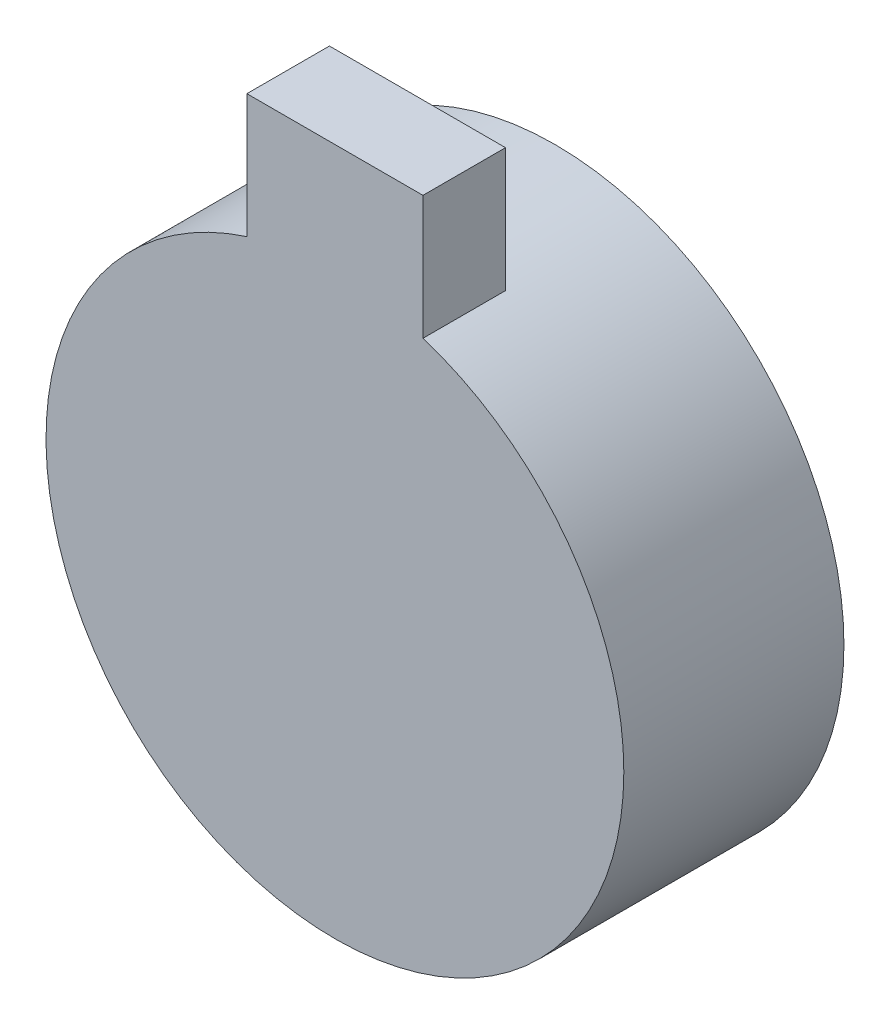
ISO-10303-21;
HEADER;
FILE_DESCRIPTION(('STEP AP214'),'2;1');
FILE_NAME('part.step','',(''),(''),'','','');
FILE_SCHEMA(('AUTOMOTIVE_DESIGN { 1 0 10303 214 1 1 1 1 }'));
ENDSEC;
DATA;
#1=APPLICATION_CONTEXT('core data for automotive mechanical design processes');
#2=APPLICATION_PROTOCOL_DEFINITION('international standard','automotive_design',2000,#1);
#3=PRODUCT_CONTEXT('',#1,'mechanical');
#4=PRODUCT('Part','Part','',(#3));
#5=PRODUCT_RELATED_PRODUCT_CATEGORY('part','',(#4));
#6=PRODUCT_DEFINITION_FORMATION('','',#4);
#7=PRODUCT_DEFINITION_CONTEXT('part definition',#1,'design');
#8=PRODUCT_DEFINITION('design','',#6,#7);
#9=PRODUCT_DEFINITION_SHAPE('','',#8);
#10=(LENGTH_UNIT() NAMED_UNIT(*) SI_UNIT(.MILLI.,.METRE.));
#11=(NAMED_UNIT(*) PLANE_ANGLE_UNIT() SI_UNIT($,.RADIAN.));
#12=(NAMED_UNIT(*) SI_UNIT($,.STERADIAN.) SOLID_ANGLE_UNIT());
#13=UNCERTAINTY_MEASURE_WITH_UNIT(LENGTH_MEASURE(1.E-05),#10,'distance_accuracy_value','');
#14=(GEOMETRIC_REPRESENTATION_CONTEXT(3) GLOBAL_UNCERTAINTY_ASSIGNED_CONTEXT((#13)) GLOBAL_UNIT_ASSIGNED_CONTEXT((#10,
#11,#12)) REPRESENTATION_CONTEXT('',''));
#15=CARTESIAN_POINT('',(0.,0.,0.));
#16=DIRECTION('',(0.,0.,1.));
#17=DIRECTION('',(1.,0.,0.));
#18=AXIS2_PLACEMENT_3D('',#15,#16,#17);
#19=CARTESIAN_POINT('',(-117.143982166874,15.4563812254755,-4.));
#20=DIRECTION('',(0.,0.,1.));
#21=DIRECTION('',(1.,0.,0.));
#22=AXIS2_PLACEMENT_3D('',#19,#20,#21);
#23=CYLINDRICAL_SURFACE('',#22,5.25);
#24=DIRECTION('',(0.,0.,1.));
#25=VECTOR('',#24,1.);
#26=CARTESIAN_POINT('',(-118.743982166875,20.4566312192259,-4.));
#27=LINE('',#26,#25);
#28=CARTESIAN_POINT('',(-118.743982166875,20.4566312192259,-1.5));
#29=VERTEX_POINT('',#28);
#30=CARTESIAN_POINT('',(-118.743982166875,20.4566312192259,0.));
#31=VERTEX_POINT('',#30);
#32=EDGE_CURVE('E107',#29,#31,#27,.T.);
#33=ORIENTED_EDGE('',*,*,#32,.F.);
#34=CARTESIAN_POINT('',(-117.143982166874,15.4563812254755,-1.5));
#35=DIRECTION('',(0.,0.,-1.));
#36=DIRECTION('',(-1.,0.,0.));
#37=AXIS2_PLACEMENT_3D('',#34,#35,#36);
#38=CIRCLE('',#37,5.25);
#39=CARTESIAN_POINT('',(-115.543982166874,20.4566312192259,-1.5));
#40=VERTEX_POINT('',#39);
#41=EDGE_CURVE('E11',#40,#29,#38,.F.);
#42=ORIENTED_EDGE('',*,*,#41,.F.);
#43=DIRECTION('',(0.,0.,1.));
#44=VECTOR('',#43,1.);
#45=CARTESIAN_POINT('',(-115.543982166874,20.4566312192259,-4.));
#46=LINE('',#45,#44);
#47=CARTESIAN_POINT('',(-115.543982166874,20.4566312192259,0.));
#48=VERTEX_POINT('',#47);
#49=EDGE_CURVE('E86',#48,#40,#46,.F.);
#50=ORIENTED_EDGE('',*,*,#49,.F.);
#51=CARTESIAN_POINT('',(-117.143982166874,15.4563812254755,0.));
#52=DIRECTION('',(0.,0.,1.));
#53=DIRECTION('',(1.,0.,0.));
#54=AXIS2_PLACEMENT_3D('',#51,#52,#53);
#55=CIRCLE('',#54,5.25);
#56=EDGE_CURVE('E109',#31,#48,#55,.T.);
#57=ORIENTED_EDGE('',*,*,#56,.F.);
#58=EDGE_LOOP('',(#33,#42,#50,#57));
#59=FACE_BOUND('',#58,.T.);
#60=CARTESIAN_POINT('',(-117.143982166874,15.4563812254755,-4.));
#61=DIRECTION('',(0.,0.,1.));
#62=DIRECTION('',(1.,0.,0.));
#63=AXIS2_PLACEMENT_3D('',#60,#61,#62);
#64=CIRCLE('',#63,5.25);
#65=CARTESIAN_POINT('',(-111.893982166874,15.4563812254755,-4.));
#66=VERTEX_POINT('',#65);
#67=EDGE_CURVE('E46',#66,#66,#64,.T.);
#68=ORIENTED_EDGE('',*,*,#67,.T.);
#69=EDGE_LOOP('',(#68));
#70=FACE_BOUND('',#69,.T.);
#71=ADVANCED_FACE('F39',(#59,#70),#23,.T.);
#72=CARTESIAN_POINT('',(-117.143982166874,15.4563812254755,-4.));
#73=DIRECTION('',(0.,0.,1.));
#74=DIRECTION('',(1.,0.,0.));
#75=AXIS2_PLACEMENT_3D('',#72,#73,#74);
#76=PLANE('',#75);
#77=ORIENTED_EDGE('',*,*,#67,.F.);
#78=EDGE_LOOP('',(#77));
#79=FACE_BOUND('',#78,.T.);
#80=ADVANCED_FACE('F125',(#79),#76,.F.);
#81=CARTESIAN_POINT('',(-117.143982166874,15.4563812254755,0.));
#82=DIRECTION('',(0.,0.,1.));
#83=DIRECTION('',(1.,0.,0.));
#84=AXIS2_PLACEMENT_3D('',#81,#82,#83);
#85=PLANE('',#84);
#86=ORIENTED_EDGE('',*,*,#56,.T.);
#87=DIRECTION('',(0.,1.,0.));
#88=VECTOR('',#87,1.);
#89=CARTESIAN_POINT('',(-115.543982166874,15.4563812254755,0.));
#90=LINE('',#89,#88);
#91=CARTESIAN_POINT('',(-115.543982166874,22.7063812254756,0.));
#92=VERTEX_POINT('',#91);
#93=EDGE_CURVE('E102',#48,#92,#90,.T.);
#94=ORIENTED_EDGE('',*,*,#93,.T.);
#95=DIRECTION('',(-1.,0.,0.));
#96=VECTOR('',#95,1.);
#97=CARTESIAN_POINT('',(-118.743982166875,22.7063812254756,0.));
#98=LINE('',#97,#96);
#99=CARTESIAN_POINT('',(-118.743982166875,22.7063812254756,0.));
#100=VERTEX_POINT('',#99);
#101=EDGE_CURVE('E94',#92,#100,#98,.T.);
#102=ORIENTED_EDGE('',*,*,#101,.T.);
#103=DIRECTION('',(0.,-1.,0.));
#104=VECTOR('',#103,1.);
#105=CARTESIAN_POINT('',(-118.743982166875,15.4563812254755,0.));
#106=LINE('',#105,#104);
#107=EDGE_CURVE('E53',#100,#31,#106,.T.);
#108=ORIENTED_EDGE('',*,*,#107,.T.);
#109=EDGE_LOOP('',(#86,#94,#102,#108));
#110=FACE_BOUND('',#109,.T.);
#111=ADVANCED_FACE('F112',(#110),#85,.T.);
#112=CARTESIAN_POINT('',(-118.743982166875,15.4563812254755,-1.5));
#113=DIRECTION('',(-1.,0.,0.));
#114=DIRECTION('',(0.,0.,1.));
#115=AXIS2_PLACEMENT_3D('',#112,#113,#114);
#116=PLANE('',#115);
#117=DIRECTION('',(0.,-1.,0.));
#118=VECTOR('',#117,1.);
#119=CARTESIAN_POINT('',(-118.743982166875,15.4563812254755,-1.5));
#120=LINE('',#119,#118);
#121=CARTESIAN_POINT('',(-118.743982166875,22.7063812254756,-1.5));
#122=VERTEX_POINT('',#121);
#123=EDGE_CURVE('E89',#122,#29,#120,.T.);
#124=ORIENTED_EDGE('',*,*,#123,.T.);
#125=ORIENTED_EDGE('',*,*,#32,.T.);
#126=ORIENTED_EDGE('',*,*,#107,.F.);
#127=DIRECTION('',(0.,0.,1.));
#128=VECTOR('',#127,1.);
#129=CARTESIAN_POINT('',(-118.743982166875,22.7063812254756,-1.5));
#130=LINE('',#129,#128);
#131=EDGE_CURVE('E95',#122,#100,#130,.T.);
#132=ORIENTED_EDGE('',*,*,#131,.F.);
#133=EDGE_LOOP('',(#124,#125,#126,#132));
#134=FACE_BOUND('',#133,.T.);
#135=ADVANCED_FACE('F117',(#134),#116,.T.);
#136=CARTESIAN_POINT('',(-118.743982166875,22.7063812254756,-1.5));
#137=DIRECTION('',(0.,1.,0.));
#138=DIRECTION('',(0.,0.,1.));
#139=AXIS2_PLACEMENT_3D('',#136,#137,#138);
#140=PLANE('',#139);
#141=ORIENTED_EDGE('',*,*,#101,.F.);
#142=DIRECTION('',(0.,0.,1.));
#143=VECTOR('',#142,1.);
#144=CARTESIAN_POINT('',(-115.543982166874,22.7063812254756,-1.5));
#145=LINE('',#144,#143);
#146=CARTESIAN_POINT('',(-115.543982166874,22.7063812254756,-1.5));
#147=VERTEX_POINT('',#146);
#148=EDGE_CURVE('E83',#147,#92,#145,.T.);
#149=ORIENTED_EDGE('',*,*,#148,.F.);
#150=DIRECTION('',(-1.,0.,0.));
#151=VECTOR('',#150,1.);
#152=CARTESIAN_POINT('',(-118.743982166875,22.7063812254756,-1.5));
#153=LINE('',#152,#151);
#154=EDGE_CURVE('E88',#147,#122,#153,.T.);
#155=ORIENTED_EDGE('',*,*,#154,.T.);
#156=ORIENTED_EDGE('',*,*,#131,.T.);
#157=EDGE_LOOP('',(#141,#149,#155,#156));
#158=FACE_BOUND('',#157,.T.);
#159=ADVANCED_FACE('F93',(#158),#140,.T.);
#160=CARTESIAN_POINT('',(-115.543982166874,15.4563812254755,-1.5));
#161=DIRECTION('',(1.,0.,0.));
#162=DIRECTION('',(0.,0.,-1.));
#163=AXIS2_PLACEMENT_3D('',#160,#161,#162);
#164=PLANE('',#163);
#165=ORIENTED_EDGE('',*,*,#93,.F.);
#166=ORIENTED_EDGE('',*,*,#49,.T.);
#167=DIRECTION('',(0.,1.,0.));
#168=VECTOR('',#167,1.);
#169=CARTESIAN_POINT('',(-115.543982166874,15.4563812254755,-1.5));
#170=LINE('',#169,#168);
#171=EDGE_CURVE('E80',#40,#147,#170,.T.);
#172=ORIENTED_EDGE('',*,*,#171,.T.);
#173=ORIENTED_EDGE('',*,*,#148,.T.);
#174=EDGE_LOOP('',(#165,#166,#172,#173));
#175=FACE_BOUND('',#174,.T.);
#176=ADVANCED_FACE('F82',(#175),#164,.T.);
#177=CARTESIAN_POINT('',(0.,0.,-1.5));
#178=DIRECTION('',(0.,0.,-1.));
#179=DIRECTION('',(-1.,0.,0.));
#180=AXIS2_PLACEMENT_3D('',#177,#178,#179);
#181=PLANE('',#180);
#182=ORIENTED_EDGE('',*,*,#171,.F.);
#183=ORIENTED_EDGE('',*,*,#41,.T.);
#184=ORIENTED_EDGE('',*,*,#123,.F.);
#185=ORIENTED_EDGE('',*,*,#154,.F.);
#186=EDGE_LOOP('',(#182,#183,#184,#185));
#187=FACE_BOUND('',#186,.T.);
#188=ADVANCED_FACE('F97',(#187),#181,.T.);
#189=CLOSED_SHELL('',(#71,#80,#111,#135,#159,#176,#188));
#190=MANIFOLD_SOLID_BREP('B2',#189);
#191=ADVANCED_BREP_SHAPE_REPRESENTATION('',(#18,#190),#14);
#192=SHAPE_DEFINITION_REPRESENTATION(#9,#191);
ENDSEC;
END-ISO-10303-21;
